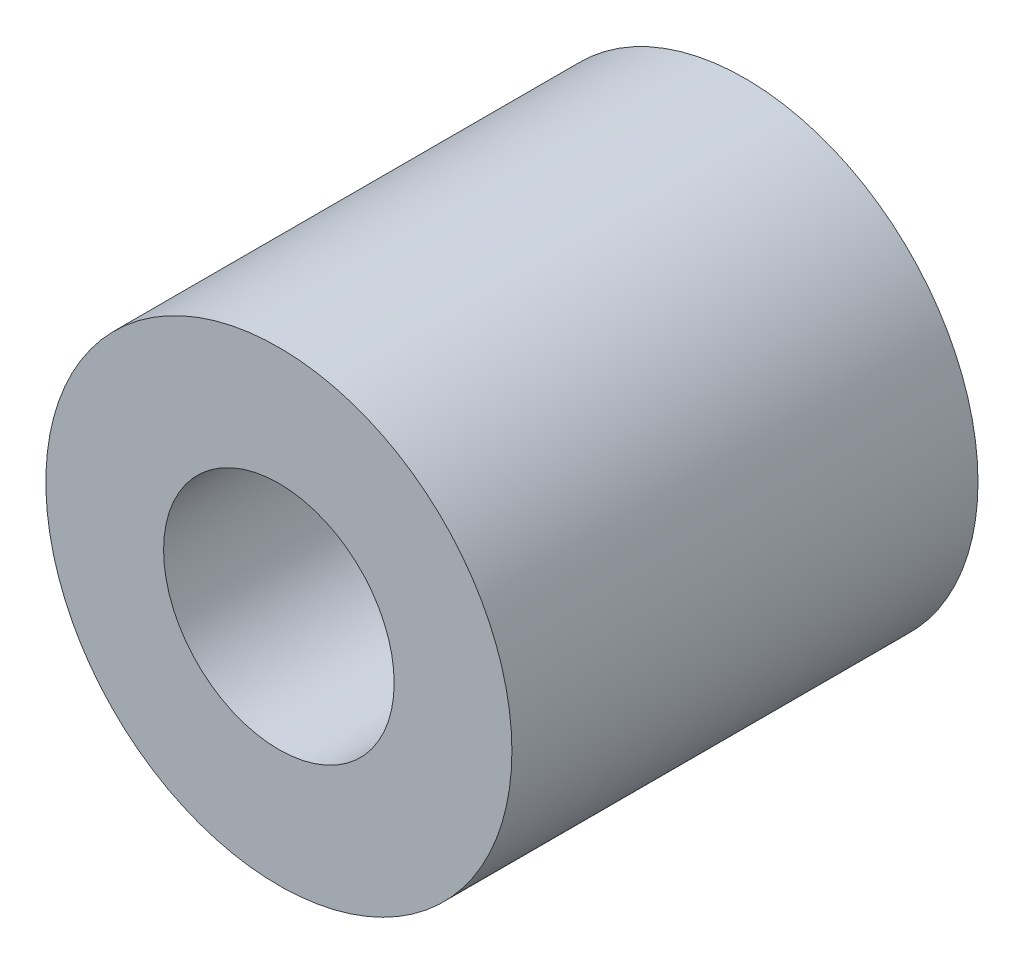
ISO-10303-21;
HEADER;
FILE_DESCRIPTION(('STEP AP214'),'2;1');
FILE_NAME('part.step','',(''),(''),'','','');
FILE_SCHEMA(('AUTOMOTIVE_DESIGN { 1 0 10303 214 1 1 1 1 }'));
ENDSEC;
DATA;
#1=APPLICATION_CONTEXT('core data for automotive mechanical design processes');
#2=APPLICATION_PROTOCOL_DEFINITION('international standard','automotive_design',2000,#1);
#3=PRODUCT_CONTEXT('',#1,'mechanical');
#4=PRODUCT('Part','Part','',(#3));
#5=PRODUCT_RELATED_PRODUCT_CATEGORY('part','',(#4));
#6=PRODUCT_DEFINITION_FORMATION('','',#4);
#7=PRODUCT_DEFINITION_CONTEXT('part definition',#1,'design');
#8=PRODUCT_DEFINITION('design','',#6,#7);
#9=PRODUCT_DEFINITION_SHAPE('','',#8);
#10=(LENGTH_UNIT() NAMED_UNIT(*) SI_UNIT(.MILLI.,.METRE.));
#11=(NAMED_UNIT(*) PLANE_ANGLE_UNIT() SI_UNIT($,.RADIAN.));
#12=(NAMED_UNIT(*) SI_UNIT($,.STERADIAN.) SOLID_ANGLE_UNIT());
#13=UNCERTAINTY_MEASURE_WITH_UNIT(LENGTH_MEASURE(1.E-05),#10,'distance_accuracy_value','');
#14=(GEOMETRIC_REPRESENTATION_CONTEXT(3) GLOBAL_UNCERTAINTY_ASSIGNED_CONTEXT((#13)) GLOBAL_UNIT_ASSIGNED_CONTEXT((#10,
#11,#12)) REPRESENTATION_CONTEXT('',''));
#15=CARTESIAN_POINT('',(0.,0.,0.));
#16=DIRECTION('',(0.,0.,1.));
#17=DIRECTION('',(1.,0.,0.));
#18=AXIS2_PLACEMENT_3D('',#15,#16,#17);
#19=CARTESIAN_POINT('',(0.,0.,-4.75));
#20=DIRECTION('',(0.,0.,1.));
#21=DIRECTION('',(1.,0.,0.));
#22=AXIS2_PLACEMENT_3D('',#19,#20,#21);
#23=CYLINDRICAL_SURFACE('',#22,4.75);
#24=CARTESIAN_POINT('',(0.,0.,-4.75));
#25=DIRECTION('',(0.,0.,1.));
#26=DIRECTION('',(1.,0.,0.));
#27=AXIS2_PLACEMENT_3D('',#24,#25,#26);
#28=CIRCLE('',#27,4.75);
#29=CARTESIAN_POINT('',(4.75,0.,-4.75));
#30=VERTEX_POINT('',#29);
#31=EDGE_CURVE('E10',#30,#30,#28,.T.);
#32=ORIENTED_EDGE('',*,*,#31,.T.);
#33=EDGE_LOOP('',(#32));
#34=FACE_BOUND('',#33,.T.);
#35=CARTESIAN_POINT('',(0.,0.,4.75));
#36=DIRECTION('',(0.,0.,1.));
#37=DIRECTION('',(1.,0.,0.));
#38=AXIS2_PLACEMENT_3D('',#35,#36,#37);
#39=CIRCLE('',#38,4.75);
#40=CARTESIAN_POINT('',(4.75,0.,4.75));
#41=VERTEX_POINT('',#40);
#42=EDGE_CURVE('E33',#41,#41,#39,.T.);
#43=ORIENTED_EDGE('',*,*,#42,.F.);
#44=EDGE_LOOP('',(#43));
#45=FACE_BOUND('',#44,.T.);
#46=ADVANCED_FACE('F30',(#34,#45),#23,.T.);
#47=CARTESIAN_POINT('',(0.,0.,-4.75));
#48=DIRECTION('',(0.,0.,1.));
#49=DIRECTION('',(1.,0.,0.));
#50=AXIS2_PLACEMENT_3D('',#47,#48,#49);
#51=PLANE('',#50);
#52=CARTESIAN_POINT('',(0.,0.,-4.75));
#53=DIRECTION('',(0.,0.,1.));
#54=DIRECTION('',(1.,0.,0.));
#55=AXIS2_PLACEMENT_3D('',#52,#53,#54);
#56=CIRCLE('',#55,2.35);
#57=CARTESIAN_POINT('',(2.35,0.,-4.75));
#58=VERTEX_POINT('',#57);
#59=EDGE_CURVE('E40',#58,#58,#56,.T.);
#60=ORIENTED_EDGE('',*,*,#59,.T.);
#61=EDGE_LOOP('',(#60));
#62=FACE_BOUND('',#61,.T.);
#63=ORIENTED_EDGE('',*,*,#31,.F.);
#64=EDGE_LOOP('',(#63));
#65=FACE_BOUND('',#64,.T.);
#66=ADVANCED_FACE('F48',(#62,#65),#51,.F.);
#67=CARTESIAN_POINT('',(0.,0.,4.75));
#68=DIRECTION('',(0.,0.,1.));
#69=DIRECTION('',(1.,0.,0.));
#70=AXIS2_PLACEMENT_3D('',#67,#68,#69);
#71=PLANE('',#70);
#72=CARTESIAN_POINT('',(0.,0.,4.75));
#73=DIRECTION('',(0.,0.,1.));
#74=DIRECTION('',(1.,0.,0.));
#75=AXIS2_PLACEMENT_3D('',#72,#73,#74);
#76=CIRCLE('',#75,2.35);
#77=CARTESIAN_POINT('',(2.35,0.,4.75));
#78=VERTEX_POINT('',#77);
#79=EDGE_CURVE('E42',#78,#78,#76,.T.);
#80=ORIENTED_EDGE('',*,*,#79,.F.);
#81=EDGE_LOOP('',(#80));
#82=FACE_BOUND('',#81,.T.);
#83=ORIENTED_EDGE('',*,*,#42,.T.);
#84=EDGE_LOOP('',(#83));
#85=FACE_BOUND('',#84,.T.);
#86=ADVANCED_FACE('F54',(#82,#85),#71,.T.);
#87=CARTESIAN_POINT('',(0.,0.,-4.75));
#88=DIRECTION('',(0.,0.,1.));
#89=DIRECTION('',(1.,0.,0.));
#90=AXIS2_PLACEMENT_3D('',#87,#88,#89);
#91=CYLINDRICAL_SURFACE('',#90,2.35);
#92=ORIENTED_EDGE('',*,*,#59,.F.);
#93=EDGE_LOOP('',(#92));
#94=FACE_BOUND('',#93,.T.);
#95=ORIENTED_EDGE('',*,*,#79,.T.);
#96=EDGE_LOOP('',(#95));
#97=FACE_BOUND('',#96,.T.);
#98=ADVANCED_FACE('F51',(#94,#97),#91,.F.);
#99=CLOSED_SHELL('',(#46,#66,#86,#98));
#100=MANIFOLD_SOLID_BREP('B2',#99);
#101=ADVANCED_BREP_SHAPE_REPRESENTATION('',(#18,#100),#14);
#102=SHAPE_DEFINITION_REPRESENTATION(#9,#101);
ENDSEC;
END-ISO-10303-21;
